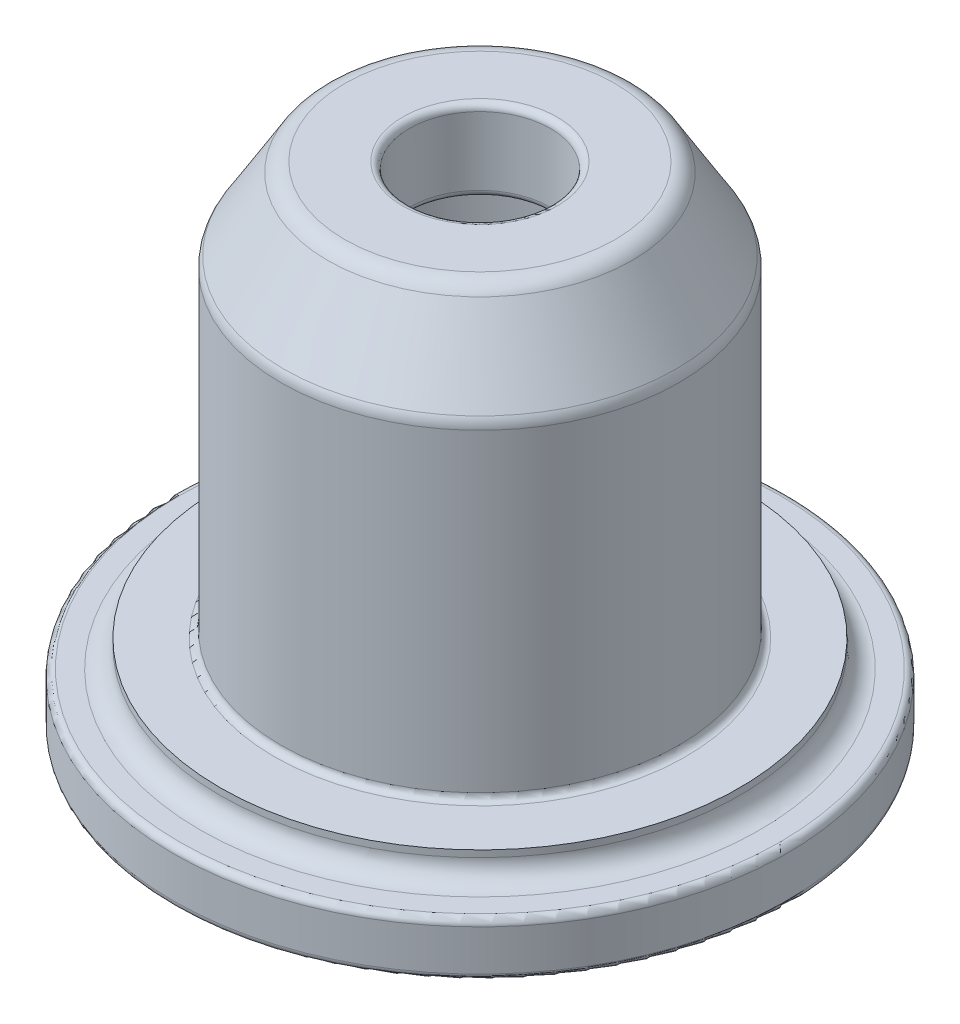
ISO-10303-21;
HEADER;
FILE_DESCRIPTION(('STEP AP214'),'2;1');
FILE_NAME('part.step','',(''),(''),'','','');
FILE_SCHEMA(('AUTOMOTIVE_DESIGN { 1 0 10303 214 1 1 1 1 }'));
ENDSEC;
DATA;
#1=APPLICATION_CONTEXT('core data for automotive mechanical design processes');
#2=APPLICATION_PROTOCOL_DEFINITION('international standard','automotive_design',2000,#1);
#3=PRODUCT_CONTEXT('',#1,'mechanical');
#4=PRODUCT('Part','Part','',(#3));
#5=PRODUCT_RELATED_PRODUCT_CATEGORY('part','',(#4));
#6=PRODUCT_DEFINITION_FORMATION('','',#4);
#7=PRODUCT_DEFINITION_CONTEXT('part definition',#1,'design');
#8=PRODUCT_DEFINITION('design','',#6,#7);
#9=PRODUCT_DEFINITION_SHAPE('','',#8);
#10=(LENGTH_UNIT() NAMED_UNIT(*) SI_UNIT(.MILLI.,.METRE.));
#11=(NAMED_UNIT(*) PLANE_ANGLE_UNIT() SI_UNIT($,.RADIAN.));
#12=(NAMED_UNIT(*) SI_UNIT($,.STERADIAN.) SOLID_ANGLE_UNIT());
#13=UNCERTAINTY_MEASURE_WITH_UNIT(LENGTH_MEASURE(1.E-05),#10,'distance_accuracy_value','');
#14=(GEOMETRIC_REPRESENTATION_CONTEXT(3) GLOBAL_UNCERTAINTY_ASSIGNED_CONTEXT((#13)) GLOBAL_UNIT_ASSIGNED_CONTEXT((#10,
#11,#12)) REPRESENTATION_CONTEXT('',''));
#15=CARTESIAN_POINT('',(0.,0.,0.));
#16=DIRECTION('',(0.,0.,1.));
#17=DIRECTION('',(1.,0.,0.));
#18=AXIS2_PLACEMENT_3D('',#15,#16,#17);
#19=CARTESIAN_POINT('',(0.,0.,0.));
#20=DIRECTION('',(0.,-1.,0.));
#21=DIRECTION('',(0.,0.,-1.));
#22=AXIS2_PLACEMENT_3D('',#19,#20,#21);
#23=CYLINDRICAL_SURFACE('',#22,7.475);
#24=CARTESIAN_POINT('',(0.,3.77,0.));
#25=DIRECTION('',(0.,1.,0.));
#26=DIRECTION('',(0.,0.,1.));
#27=AXIS2_PLACEMENT_3D('',#24,#25,#26);
#28=CIRCLE('',#27,7.475);
#29=CARTESIAN_POINT('',(0.,3.77,7.475));
#30=VERTEX_POINT('',#29);
#31=EDGE_CURVE('E51',#30,#30,#28,.T.);
#32=ORIENTED_EDGE('',*,*,#31,.T.);
#33=EDGE_LOOP('',(#32));
#34=FACE_BOUND('',#33,.T.);
#35=CARTESIAN_POINT('',(0.,15.559984223068,0.));
#36=DIRECTION('',(0.,1.,0.));
#37=DIRECTION('',(0.,0.,1.));
#38=AXIS2_PLACEMENT_3D('',#35,#36,#37);
#39=CIRCLE('',#38,7.475);
#40=CARTESIAN_POINT('',(0.,15.559984223068,7.475));
#41=VERTEX_POINT('',#40);
#42=EDGE_CURVE('E139',#41,#41,#39,.F.);
#43=ORIENTED_EDGE('',*,*,#42,.T.);
#44=EDGE_LOOP('',(#43));
#45=FACE_BOUND('',#44,.T.);
#46=ADVANCED_FACE('F43',(#34,#45),#23,.T.);
#47=CARTESIAN_POINT('',(0.,15.77,0.));
#48=DIRECTION('',(0.,-1.,0.));
#49=DIRECTION('',(0.,0.,-1.));
#50=AXIS2_PLACEMENT_3D('',#47,#48,#49);
#51=CONICAL_SURFACE('',#50,7.475,0.546056419145215);
#52=CARTESIAN_POINT('',(0.,18.6594908804214,0.));
#53=DIRECTION('',(0.,1.,0.));
#54=DIRECTION('',(0.,0.,1.));
#55=AXIS2_PLACEMENT_3D('',#52,#53,#54);
#56=CIRCLE('',#55,5.71907861882082);
#57=CARTESIAN_POINT('',(0.,18.6594908804214,5.71907861882082));
#58=VERTEX_POINT('',#57);
#59=EDGE_CURVE('E147',#58,#58,#56,.F.);
#60=ORIENTED_EDGE('',*,*,#59,.T.);
#61=EDGE_LOOP('',(#60));
#62=FACE_BOUND('',#61,.T.);
#63=CARTESIAN_POINT('',(0.,15.9494751034895,0.));
#64=DIRECTION('',(0.,1.,0.));
#65=DIRECTION('',(0.,0.,1.));
#66=AXIS2_PLACEMENT_3D('',#63,#64,#65);
#67=CIRCLE('',#66,7.36593436018717);
#68=CARTESIAN_POINT('',(0.,15.9494751034895,7.36593436018717));
#69=VERTEX_POINT('',#68);
#70=EDGE_CURVE('E151',#69,#69,#67,.T.);
#71=ORIENTED_EDGE('',*,*,#70,.T.);
#72=EDGE_LOOP('',(#71));
#73=FACE_BOUND('',#72,.T.);
#74=ADVANCED_FACE('F180',(#62,#73),#51,.T.);
#75=CARTESIAN_POINT('',(2.65,19.02,0.));
#76=DIRECTION('',(0.,1.,0.));
#77=DIRECTION('',(0.,0.,1.));
#78=AXIS2_PLACEMENT_3D('',#75,#76,#77);
#79=PLANE('',#78);
#80=CARTESIAN_POINT('',(0.,19.02,0.));
#81=DIRECTION('',(0.,1.,0.));
#82=DIRECTION('',(0.,0.,1.));
#83=AXIS2_PLACEMENT_3D('',#80,#81,#82);
#84=CIRCLE('',#83,2.9);
#85=CARTESIAN_POINT('',(0.,19.02,2.9));
#86=VERTEX_POINT('',#85);
#87=EDGE_CURVE('E111',#86,#86,#84,.F.);
#88=ORIENTED_EDGE('',*,*,#87,.T.);
#89=EDGE_LOOP('',(#88));
#90=FACE_BOUND('',#89,.T.);
#91=CARTESIAN_POINT('',(0.,19.02,0.));
#92=DIRECTION('',(0.,1.,0.));
#93=DIRECTION('',(0.,0.,1.));
#94=AXIS2_PLACEMENT_3D('',#91,#92,#93);
#95=CIRCLE('',#94,5.07814425863365);
#96=CARTESIAN_POINT('',(0.,19.02,5.07814425863365));
#97=VERTEX_POINT('',#96);
#98=EDGE_CURVE('E143',#97,#97,#95,.T.);
#99=ORIENTED_EDGE('',*,*,#98,.T.);
#100=EDGE_LOOP('',(#99));
#101=FACE_BOUND('',#100,.T.);
#102=ADVANCED_FACE('F187',(#90,#101),#79,.T.);
#103=CARTESIAN_POINT('',(0.,0.,0.));
#104=DIRECTION('',(0.,-1.,0.));
#105=DIRECTION('',(0.,0.,-1.));
#106=AXIS2_PLACEMENT_3D('',#103,#104,#105);
#107=CYLINDRICAL_SURFACE('',#106,2.65);
#108=CARTESIAN_POINT('',(0.,18.77,0.));
#109=DIRECTION('',(0.,1.,0.));
#110=DIRECTION('',(0.,0.,1.));
#111=AXIS2_PLACEMENT_3D('',#108,#109,#110);
#112=CIRCLE('',#111,2.65);
#113=CARTESIAN_POINT('',(0.,18.77,2.65));
#114=VERTEX_POINT('',#113);
#115=EDGE_CURVE('E103',#114,#114,#112,.T.);
#116=ORIENTED_EDGE('',*,*,#115,.T.);
#117=EDGE_LOOP('',(#116));
#118=FACE_BOUND('',#117,.T.);
#119=CARTESIAN_POINT('',(0.,16.21,0.));
#120=DIRECTION('',(0.,-1.,0.));
#121=DIRECTION('',(0.,0.,-1.));
#122=AXIS2_PLACEMENT_3D('',#119,#120,#121);
#123=CIRCLE('',#122,2.65);
#124=CARTESIAN_POINT('',(0.,16.21,-2.65));
#125=VERTEX_POINT('',#124);
#126=EDGE_CURVE('E107',#125,#125,#123,.T.);
#127=ORIENTED_EDGE('',*,*,#126,.T.);
#128=EDGE_LOOP('',(#127));
#129=FACE_BOUND('',#128,.T.);
#130=ADVANCED_FACE('F274',(#118,#129),#107,.F.);
#131=CARTESIAN_POINT('',(5.5,15.96,0.));
#132=DIRECTION('',(0.,-1.,0.));
#133=DIRECTION('',(0.,0.,-1.));
#134=AXIS2_PLACEMENT_3D('',#131,#132,#133);
#135=PLANE('',#134);
#136=CARTESIAN_POINT('',(0.,15.96,0.));
#137=DIRECTION('',(0.,-1.,0.));
#138=DIRECTION('',(0.,0.,-1.));
#139=AXIS2_PLACEMENT_3D('',#136,#137,#138);
#140=CIRCLE('',#139,2.9);
#141=CARTESIAN_POINT('',(0.,15.96,-2.9));
#142=VERTEX_POINT('',#141);
#143=EDGE_CURVE('E95',#142,#142,#140,.F.);
#144=ORIENTED_EDGE('',*,*,#143,.T.);
#145=EDGE_LOOP('',(#144));
#146=FACE_BOUND('',#145,.T.);
#147=CARTESIAN_POINT('',(0.,15.96,0.));
#148=DIRECTION('',(0.,-1.,0.));
#149=DIRECTION('',(0.,0.,-1.));
#150=AXIS2_PLACEMENT_3D('',#147,#148,#149);
#151=CIRCLE('',#150,5.25);
#152=CARTESIAN_POINT('',(0.,15.96,-5.25));
#153=VERTEX_POINT('',#152);
#154=EDGE_CURVE('E99',#153,#153,#151,.T.);
#155=ORIENTED_EDGE('',*,*,#154,.T.);
#156=EDGE_LOOP('',(#155));
#157=FACE_BOUND('',#156,.T.);
#158=ADVANCED_FACE('F270',(#146,#157),#135,.T.);
#159=CARTESIAN_POINT('',(0.,0.,0.));
#160=DIRECTION('',(0.,-1.,0.));
#161=DIRECTION('',(0.,0.,-1.));
#162=AXIS2_PLACEMENT_3D('',#159,#160,#161);
#163=CYLINDRICAL_SURFACE('',#162,5.5);
#164=CARTESIAN_POINT('',(0.,15.71,0.));
#165=DIRECTION('',(0.,-1.,0.));
#166=DIRECTION('',(0.,0.,-1.));
#167=AXIS2_PLACEMENT_3D('',#164,#165,#166);
#168=CIRCLE('',#167,5.5);
#169=CARTESIAN_POINT('',(0.,15.71,-5.5));
#170=VERTEX_POINT('',#169);
#171=EDGE_CURVE('E87',#170,#170,#168,.F.);
#172=ORIENTED_EDGE('',*,*,#171,.T.);
#173=EDGE_LOOP('',(#172));
#174=FACE_BOUND('',#173,.T.);
#175=CARTESIAN_POINT('',(0.,10.079530252425,0.));
#176=DIRECTION('',(0.,1.,0.));
#177=DIRECTION('',(0.,0.,1.));
#178=AXIS2_PLACEMENT_3D('',#175,#176,#177);
#179=CIRCLE('',#178,5.5);
#180=CARTESIAN_POINT('',(0.,10.079530252425,5.5));
#181=VERTEX_POINT('',#180);
#182=EDGE_CURVE('E91',#181,#181,#179,.F.);
#183=ORIENTED_EDGE('',*,*,#182,.T.);
#184=EDGE_LOOP('',(#183));
#185=FACE_BOUND('',#184,.T.);
#186=ADVANCED_FACE('F266',(#174,#185),#163,.F.);
#187=CARTESIAN_POINT('',(0.,9.97524752475248,0.));
#188=DIRECTION('',(0.,-1.,0.));
#189=DIRECTION('',(0.,0.,-1.));
#190=AXIS2_PLACEMENT_3D('',#187,#188,#189);
#191=CONICAL_SURFACE('',#190,5.5,0.790373246728302);
#192=CARTESIAN_POINT('',(0.,9.901876269702,0.));
#193=DIRECTION('',(0.,1.,0.));
#194=DIRECTION('',(0.,0.,1.));
#195=AXIS2_PLACEMENT_3D('',#192,#193,#194);
#196=CIRCLE('',#195,5.57410496760098);
#197=CARTESIAN_POINT('',(0.,9.901876269702,5.57410496760098));
#198=VERTEX_POINT('',#197);
#199=EDGE_CURVE('E79',#198,#198,#196,.T.);
#200=ORIENTED_EDGE('',*,*,#199,.T.);
#201=EDGE_LOOP('',(#200));
#202=FACE_BOUND('',#201,.T.);
#203=CARTESIAN_POINT('',(0.,9.57337125505048,0.));
#204=DIRECTION('',(0.,-1.,0.));
#205=DIRECTION('',(0.,0.,-1.));
#206=AXIS2_PLACEMENT_3D('',#203,#204,#205);
#207=CIRCLE('',#206,5.90589503239902);
#208=CARTESIAN_POINT('',(0.,9.57337125505048,-5.90589503239902));
#209=VERTEX_POINT('',#208);
#210=EDGE_CURVE('E83',#209,#209,#207,.T.);
#211=ORIENTED_EDGE('',*,*,#210,.T.);
#212=EDGE_LOOP('',(#211));
#213=FACE_BOUND('',#212,.T.);
#214=ADVANCED_FACE('F262',(#202,#213),#191,.F.);
#215=CARTESIAN_POINT('',(0.,0.,0.));
#216=DIRECTION('',(0.,-1.,0.));
#217=DIRECTION('',(0.,0.,-1.));
#218=AXIS2_PLACEMENT_3D('',#215,#216,#217);
#219=CYLINDRICAL_SURFACE('',#218,5.98);
#220=CARTESIAN_POINT('',(0.,9.39571727232746,0.));
#221=DIRECTION('',(0.,-1.,0.));
#222=DIRECTION('',(0.,0.,-1.));
#223=AXIS2_PLACEMENT_3D('',#220,#221,#222);
#224=CIRCLE('',#223,5.98);
#225=CARTESIAN_POINT('',(0.,9.39571727232746,-5.98));
#226=VERTEX_POINT('',#225);
#227=EDGE_CURVE('E71',#226,#226,#224,.F.);
#228=ORIENTED_EDGE('',*,*,#227,.T.);
#229=EDGE_LOOP('',(#228));
#230=FACE_BOUND('',#229,.T.);
#231=CARTESIAN_POINT('',(0.,2.10428272767254,0.));
#232=DIRECTION('',(0.,1.,0.));
#233=DIRECTION('',(0.,0.,1.));
#234=AXIS2_PLACEMENT_3D('',#231,#232,#233);
#235=CIRCLE('',#234,5.98);
#236=CARTESIAN_POINT('',(0.,2.10428272767254,5.98));
#237=VERTEX_POINT('',#236);
#238=EDGE_CURVE('E75',#237,#237,#235,.F.);
#239=ORIENTED_EDGE('',*,*,#238,.T.);
#240=EDGE_LOOP('',(#239));
#241=FACE_BOUND('',#240,.T.);
#242=ADVANCED_FACE('F258',(#230,#241),#219,.F.);
#243=CARTESIAN_POINT('',(0.,2.,0.));
#244=DIRECTION('',(0.,-1.,0.));
#245=DIRECTION('',(0.,0.,-1.));
#246=AXIS2_PLACEMENT_3D('',#243,#244,#245);
#247=CONICAL_SURFACE('',#246,5.98,0.790373246728302);
#248=CARTESIAN_POINT('',(0.,1.92662874494952,0.));
#249=DIRECTION('',(0.,1.,0.));
#250=DIRECTION('',(0.,0.,1.));
#251=AXIS2_PLACEMENT_3D('',#248,#249,#250);
#252=CIRCLE('',#251,6.05410496760098);
#253=CARTESIAN_POINT('',(0.,1.92662874494952,6.05410496760098));
#254=VERTEX_POINT('',#253);
#255=EDGE_CURVE('E61',#254,#254,#252,.T.);
#256=ORIENTED_EDGE('',*,*,#255,.T.);
#257=EDGE_LOOP('',(#256));
#258=FACE_BOUND('',#257,.T.);
#259=CARTESIAN_POINT('',(0.,0.087902368873247,0.));
#260=DIRECTION('',(0.,1.,0.));
#261=DIRECTION('',(0.,0.,1.));
#262=AXIS2_PLACEMENT_3D('',#259,#260,#261);
#263=CIRCLE('',#262,7.91121860743802);
#264=CARTESIAN_POINT('',(0.,0.087902368873247,7.91121860743802));
#265=VERTEX_POINT('',#264);
#266=EDGE_CURVE('E67',#265,#265,#263,.F.);
#267=ORIENTED_EDGE('',*,*,#266,.T.);
#268=EDGE_LOOP('',(#267));
#269=FACE_BOUND('',#268,.T.);
#270=ADVANCED_FACE('F252',(#258,#269),#247,.F.);
#271=CARTESIAN_POINT('',(0.,0.,0.));
#272=DIRECTION('',(0.,1.,0.));
#273=DIRECTION('',(0.,0.,1.));
#274=AXIS2_PLACEMENT_3D('',#271,#272,#273);
#275=CONICAL_SURFACE('',#274,8.,1.42433490619019);
#276=CARTESIAN_POINT('',(0.,0.488502691261832,0.));
#277=DIRECTION('',(0.,-1.,0.));
#278=DIRECTION('',(0.,0.,-1.));
#279=AXIS2_PLACEMENT_3D('',#276,#277,#278);
#280=CIRCLE('',#279,11.3114845898038);
#281=CARTESIAN_POINT('',(0.,0.488502691261832,-11.3114845898038));
#282=VERTEX_POINT('',#281);
#283=EDGE_CURVE('E123',#282,#282,#280,.T.);
#284=ORIENTED_EDGE('',*,*,#283,.T.);
#285=EDGE_LOOP('',(#284));
#286=FACE_BOUND('',#285,.T.);
#287=CARTESIAN_POINT('',(0.,0.0182329303299983,0.));
#288=DIRECTION('',(0.,-1.,0.));
#289=DIRECTION('',(0.,0.,-1.));
#290=AXIS2_PLACEMENT_3D('',#287,#288,#289);
#291=CIRCLE('',#290,8.12359822964086);
#292=CARTESIAN_POINT('',(0.,0.0182329303299983,-8.12359822964086));
#293=VERTEX_POINT('',#292);
#294=EDGE_CURVE('E127',#293,#293,#291,.F.);
#295=ORIENTED_EDGE('',*,*,#294,.T.);
#296=EDGE_LOOP('',(#295));
#297=FACE_BOUND('',#296,.T.);
#298=ADVANCED_FACE('F245',(#286,#297),#275,.T.);
#299=CARTESIAN_POINT('',(0.,0.,0.));
#300=DIRECTION('',(0.,-1.,0.));
#301=DIRECTION('',(0.,0.,-1.));
#302=AXIS2_PLACEMENT_3D('',#299,#300,#301);
#303=CYLINDRICAL_SURFACE('',#302,11.525);
#304=CARTESIAN_POINT('',(0.,0.735826112528091,0.));
#305=DIRECTION('',(0.,1.,0.));
#306=DIRECTION('',(0.,0.,1.));
#307=AXIS2_PLACEMENT_3D('',#304,#305,#306);
#308=CIRCLE('',#307,11.525);
#309=CARTESIAN_POINT('',(0.,0.735826112528091,11.525));
#310=VERTEX_POINT('',#309);
#311=EDGE_CURVE('E115',#310,#310,#308,.T.);
#312=ORIENTED_EDGE('',*,*,#311,.T.);
#313=EDGE_LOOP('',(#312));
#314=FACE_BOUND('',#313,.T.);
#315=CARTESIAN_POINT('',(0.,2.27,0.));
#316=DIRECTION('',(0.,1.,0.));
#317=DIRECTION('',(0.,0.,1.));
#318=AXIS2_PLACEMENT_3D('',#315,#316,#317);
#319=CIRCLE('',#318,11.525);
#320=CARTESIAN_POINT('',(0.,2.27,11.525));
#321=VERTEX_POINT('',#320);
#322=EDGE_CURVE('E119',#321,#321,#319,.F.);
#323=ORIENTED_EDGE('',*,*,#322,.T.);
#324=EDGE_LOOP('',(#323));
#325=FACE_BOUND('',#324,.T.);
#326=ADVANCED_FACE('F243',(#314,#325),#303,.T.);
#327=CARTESIAN_POINT('',(9.75,2.52,0.));
#328=DIRECTION('',(0.,1.,0.));
#329=DIRECTION('',(0.,0.,1.));
#330=AXIS2_PLACEMENT_3D('',#327,#328,#329);
#331=PLANE('',#330);
#332=CARTESIAN_POINT('',(0.,2.52,0.));
#333=DIRECTION('',(0.,1.,0.));
#334=DIRECTION('',(0.,0.,1.));
#335=AXIS2_PLACEMENT_3D('',#332,#333,#334);
#336=CIRCLE('',#335,11.275);
#337=CARTESIAN_POINT('',(0.,2.52,11.275));
#338=VERTEX_POINT('',#337);
#339=EDGE_CURVE('E10',#338,#338,#336,.T.);
#340=ORIENTED_EDGE('',*,*,#339,.T.);
#341=EDGE_LOOP('',(#340));
#342=FACE_BOUND('',#341,.T.);
#343=CARTESIAN_POINT('',(0.,2.52,0.));
#344=DIRECTION('',(0.,1.,0.));
#345=DIRECTION('',(0.,0.,1.));
#346=AXIS2_PLACEMENT_3D('',#343,#344,#345);
#347=CIRCLE('',#346,10.5);
#348=CARTESIAN_POINT('',(0.,2.52,10.5));
#349=VERTEX_POINT('',#348);
#350=EDGE_CURVE('E135',#349,#349,#347,.F.);
#351=ORIENTED_EDGE('',*,*,#350,.T.);
#352=EDGE_LOOP('',(#351));
#353=FACE_BOUND('',#352,.T.);
#354=ADVANCED_FACE('F176',(#342,#353),#331,.T.);
#355=CARTESIAN_POINT('',(0.,0.,0.));
#356=DIRECTION('',(0.,-1.,0.));
#357=DIRECTION('',(0.,0.,-1.));
#358=AXIS2_PLACEMENT_3D('',#355,#356,#357);
#359=CYLINDRICAL_SURFACE('',#358,9.75);
#360=CARTESIAN_POINT('',(0.,3.27,0.));
#361=DIRECTION('',(0.,1.,0.));
#362=DIRECTION('',(0.,0.,1.));
#363=AXIS2_PLACEMENT_3D('',#360,#361,#362);
#364=CIRCLE('',#363,9.75);
#365=CARTESIAN_POINT('',(0.,3.27,9.75));
#366=VERTEX_POINT('',#365);
#367=EDGE_CURVE('E131',#366,#366,#364,.T.);
#368=ORIENTED_EDGE('',*,*,#367,.T.);
#369=EDGE_LOOP('',(#368));
#370=FACE_BOUND('',#369,.T.);
#371=CARTESIAN_POINT('',(0.,3.52,0.));
#372=DIRECTION('',(0.,-1.,0.));
#373=DIRECTION('',(0.,0.,-1.));
#374=AXIS2_PLACEMENT_3D('',#371,#372,#373);
#375=CIRCLE('',#374,9.75);
#376=CARTESIAN_POINT('',(0.,3.52,-9.75));
#377=VERTEX_POINT('',#376);
#378=EDGE_CURVE('E155',#377,#377,#375,.T.);
#379=ORIENTED_EDGE('',*,*,#378,.T.);
#380=EDGE_LOOP('',(#379));
#381=FACE_BOUND('',#380,.T.);
#382=ADVANCED_FACE('F160',(#370,#381),#359,.T.);
#383=CARTESIAN_POINT('',(7.475,3.52,0.));
#384=DIRECTION('',(0.,1.,0.));
#385=DIRECTION('',(0.,0.,1.));
#386=AXIS2_PLACEMENT_3D('',#383,#384,#385);
#387=PLANE('',#386);
#388=CARTESIAN_POINT('',(0.,3.52,0.));
#389=DIRECTION('',(0.,1.,0.));
#390=DIRECTION('',(0.,0.,1.));
#391=AXIS2_PLACEMENT_3D('',#388,#389,#390);
#392=CIRCLE('',#391,7.725);
#393=CARTESIAN_POINT('',(0.,3.52,7.725));
#394=VERTEX_POINT('',#393);
#395=EDGE_CURVE('E56',#394,#394,#392,.F.);
#396=ORIENTED_EDGE('',*,*,#395,.T.);
#397=EDGE_LOOP('',(#396));
#398=FACE_BOUND('',#397,.T.);
#399=ORIENTED_EDGE('',*,*,#378,.F.);
#400=EDGE_LOOP('',(#399));
#401=FACE_BOUND('',#400,.T.);
#402=ADVANCED_FACE('F162',(#398,#401),#387,.T.);
#403=CARTESIAN_POINT('',(0.,18.27,0.));
#404=DIRECTION('',(0.,1.,0.));
#405=DIRECTION('',(0.,0.,1.));
#406=AXIS2_PLACEMENT_3D('',#403,#404,#405);
#407=TOROIDAL_SURFACE('',#406,5.07814425863365,0.75);
#408=ORIENTED_EDGE('',*,*,#98,.F.);
#409=EDGE_LOOP('',(#408));
#410=FACE_BOUND('',#409,.T.);
#411=ORIENTED_EDGE('',*,*,#59,.F.);
#412=EDGE_LOOP('',(#411));
#413=FACE_BOUND('',#412,.T.);
#414=ADVANCED_FACE('F164',(#410,#413),#407,.T.);
#415=CARTESIAN_POINT('',(0.,15.559984223068,0.));
#416=DIRECTION('',(0.,1.,0.));
#417=DIRECTION('',(0.,0.,1.));
#418=AXIS2_PLACEMENT_3D('',#415,#416,#417);
#419=TOROIDAL_SURFACE('',#418,6.725,0.75);
#420=ORIENTED_EDGE('',*,*,#70,.F.);
#421=EDGE_LOOP('',(#420));
#422=FACE_BOUND('',#421,.T.);
#423=ORIENTED_EDGE('',*,*,#42,.F.);
#424=EDGE_LOOP('',(#423));
#425=FACE_BOUND('',#424,.T.);
#426=ADVANCED_FACE('F172',(#422,#425),#419,.T.);
#427=CARTESIAN_POINT('',(0.,3.27,0.));
#428=DIRECTION('',(0.,1.,0.));
#429=DIRECTION('',(0.,0.,1.));
#430=AXIS2_PLACEMENT_3D('',#427,#428,#429);
#431=TOROIDAL_SURFACE('',#430,10.5,0.75);
#432=ORIENTED_EDGE('',*,*,#367,.F.);
#433=EDGE_LOOP('',(#432));
#434=FACE_BOUND('',#433,.T.);
#435=ORIENTED_EDGE('',*,*,#350,.F.);
#436=EDGE_LOOP('',(#435));
#437=FACE_BOUND('',#436,.T.);
#438=ADVANCED_FACE('F195',(#434,#437),#431,.F.);
#439=CARTESIAN_POINT('',(0.,0.735826112528091,0.));
#440=DIRECTION('',(0.,1.,0.));
#441=DIRECTION('',(0.,0.,1.));
#442=AXIS2_PLACEMENT_3D('',#439,#440,#441);
#443=TOROIDAL_SURFACE('',#442,11.275,0.25);
#444=ORIENTED_EDGE('',*,*,#311,.F.);
#445=EDGE_LOOP('',(#444));
#446=FACE_BOUND('',#445,.T.);
#447=ORIENTED_EDGE('',*,*,#283,.F.);
#448=EDGE_LOOP('',(#447));
#449=FACE_BOUND('',#448,.T.);
#450=ADVANCED_FACE('F198',(#446,#449),#443,.T.);
#451=CARTESIAN_POINT('',(0.,18.77,0.));
#452=DIRECTION('',(0.,1.,0.));
#453=DIRECTION('',(0.,0.,1.));
#454=AXIS2_PLACEMENT_3D('',#451,#452,#453);
#455=TOROIDAL_SURFACE('',#454,2.9,0.25);
#456=ORIENTED_EDGE('',*,*,#115,.F.);
#457=EDGE_LOOP('',(#456));
#458=FACE_BOUND('',#457,.T.);
#459=ORIENTED_EDGE('',*,*,#87,.F.);
#460=EDGE_LOOP('',(#459));
#461=FACE_BOUND('',#460,.T.);
#462=ADVANCED_FACE('F201',(#458,#461),#455,.T.);
#463=CARTESIAN_POINT('',(0.,16.21,0.));
#464=DIRECTION('',(0.,-1.,0.));
#465=DIRECTION('',(0.,0.,-1.));
#466=AXIS2_PLACEMENT_3D('',#463,#464,#465);
#467=TOROIDAL_SURFACE('',#466,2.9,0.25);
#468=ORIENTED_EDGE('',*,*,#143,.F.);
#469=EDGE_LOOP('',(#468));
#470=FACE_BOUND('',#469,.T.);
#471=ORIENTED_EDGE('',*,*,#126,.F.);
#472=EDGE_LOOP('',(#471));
#473=FACE_BOUND('',#472,.T.);
#474=ADVANCED_FACE('F205',(#470,#473),#467,.T.);
#475=CARTESIAN_POINT('',(0.,15.71,0.));
#476=DIRECTION('',(0.,-1.,0.));
#477=DIRECTION('',(0.,0.,-1.));
#478=AXIS2_PLACEMENT_3D('',#475,#476,#477);
#479=TOROIDAL_SURFACE('',#478,5.25,0.25);
#480=ORIENTED_EDGE('',*,*,#171,.F.);
#481=EDGE_LOOP('',(#480));
#482=FACE_BOUND('',#481,.T.);
#483=ORIENTED_EDGE('',*,*,#154,.F.);
#484=EDGE_LOOP('',(#483));
#485=FACE_BOUND('',#484,.T.);
#486=ADVANCED_FACE('F209',(#482,#485),#479,.F.);
#487=CARTESIAN_POINT('',(0.,10.079530252425,0.));
#488=DIRECTION('',(0.,1.,0.));
#489=DIRECTION('',(0.,0.,1.));
#490=AXIS2_PLACEMENT_3D('',#487,#488,#489);
#491=TOROIDAL_SURFACE('',#490,5.75,0.25);
#492=ORIENTED_EDGE('',*,*,#199,.F.);
#493=EDGE_LOOP('',(#492));
#494=FACE_BOUND('',#493,.T.);
#495=ORIENTED_EDGE('',*,*,#182,.F.);
#496=EDGE_LOOP('',(#495));
#497=FACE_BOUND('',#496,.T.);
#498=ADVANCED_FACE('F213',(#494,#497),#491,.T.);
#499=CARTESIAN_POINT('',(0.,9.39571727232746,0.));
#500=DIRECTION('',(0.,-1.,0.));
#501=DIRECTION('',(0.,0.,-1.));
#502=AXIS2_PLACEMENT_3D('',#499,#500,#501);
#503=TOROIDAL_SURFACE('',#502,5.73,0.25);
#504=ORIENTED_EDGE('',*,*,#227,.F.);
#505=EDGE_LOOP('',(#504));
#506=FACE_BOUND('',#505,.T.);
#507=ORIENTED_EDGE('',*,*,#210,.F.);
#508=EDGE_LOOP('',(#507));
#509=FACE_BOUND('',#508,.T.);
#510=ADVANCED_FACE('F217',(#506,#509),#503,.F.);
#511=CARTESIAN_POINT('',(0.,2.10428272767254,0.));
#512=DIRECTION('',(0.,1.,0.));
#513=DIRECTION('',(0.,0.,1.));
#514=AXIS2_PLACEMENT_3D('',#511,#512,#513);
#515=TOROIDAL_SURFACE('',#514,6.23,0.25);
#516=ORIENTED_EDGE('',*,*,#255,.F.);
#517=EDGE_LOOP('',(#516));
#518=FACE_BOUND('',#517,.T.);
#519=ORIENTED_EDGE('',*,*,#238,.F.);
#520=EDGE_LOOP('',(#519));
#521=FACE_BOUND('',#520,.T.);
#522=ADVANCED_FACE('F221',(#518,#521),#515,.T.);
#523=CARTESIAN_POINT('',(0.,0.265556351596257,0.));
#524=DIRECTION('',(0.,1.,0.));
#525=DIRECTION('',(0.,0.,1.));
#526=AXIS2_PLACEMENT_3D('',#523,#524,#525);
#527=TOROIDAL_SURFACE('',#526,8.08711363983704,0.25);
#528=ORIENTED_EDGE('',*,*,#294,.F.);
#529=EDGE_LOOP('',(#528));
#530=FACE_BOUND('',#529,.T.);
#531=ORIENTED_EDGE('',*,*,#266,.F.);
#532=EDGE_LOOP('',(#531));
#533=FACE_BOUND('',#532,.T.);
#534=ADVANCED_FACE('F225',(#530,#533),#527,.T.);
#535=CARTESIAN_POINT('',(0.,3.77,0.));
#536=DIRECTION('',(0.,1.,0.));
#537=DIRECTION('',(0.,0.,1.));
#538=AXIS2_PLACEMENT_3D('',#535,#536,#537);
#539=TOROIDAL_SURFACE('',#538,7.725,0.25);
#540=ORIENTED_EDGE('',*,*,#31,.F.);
#541=EDGE_LOOP('',(#540));
#542=FACE_BOUND('',#541,.T.);
#543=ORIENTED_EDGE('',*,*,#395,.F.);
#544=EDGE_LOOP('',(#543));
#545=FACE_BOUND('',#544,.T.);
#546=ADVANCED_FACE('F228',(#542,#545),#539,.F.);
#547=CARTESIAN_POINT('',(0.,2.27,0.));
#548=DIRECTION('',(0.,1.,0.));
#549=DIRECTION('',(0.,0.,1.));
#550=AXIS2_PLACEMENT_3D('',#547,#548,#549);
#551=TOROIDAL_SURFACE('',#550,11.275,0.25);
#552=ORIENTED_EDGE('',*,*,#339,.F.);
#553=EDGE_LOOP('',(#552));
#554=FACE_BOUND('',#553,.T.);
#555=ORIENTED_EDGE('',*,*,#322,.F.);
#556=EDGE_LOOP('',(#555));
#557=FACE_BOUND('',#556,.T.);
#558=ADVANCED_FACE('F45',(#554,#557),#551,.T.);
#559=CLOSED_SHELL('',(#46,#74,#102,#130,#158,#186,#214,#242,#270,#298,#326,#354,#382,#402,#414,
#426,#438,#450,#462,#474,#486,#498,#510,#522,#534,#546,#558));
#560=MANIFOLD_SOLID_BREP('B2',#559);
#561=ADVANCED_BREP_SHAPE_REPRESENTATION('',(#18,#560),#14);
#562=SHAPE_DEFINITION_REPRESENTATION(#9,#561);
ENDSEC;
END-ISO-10303-21;
